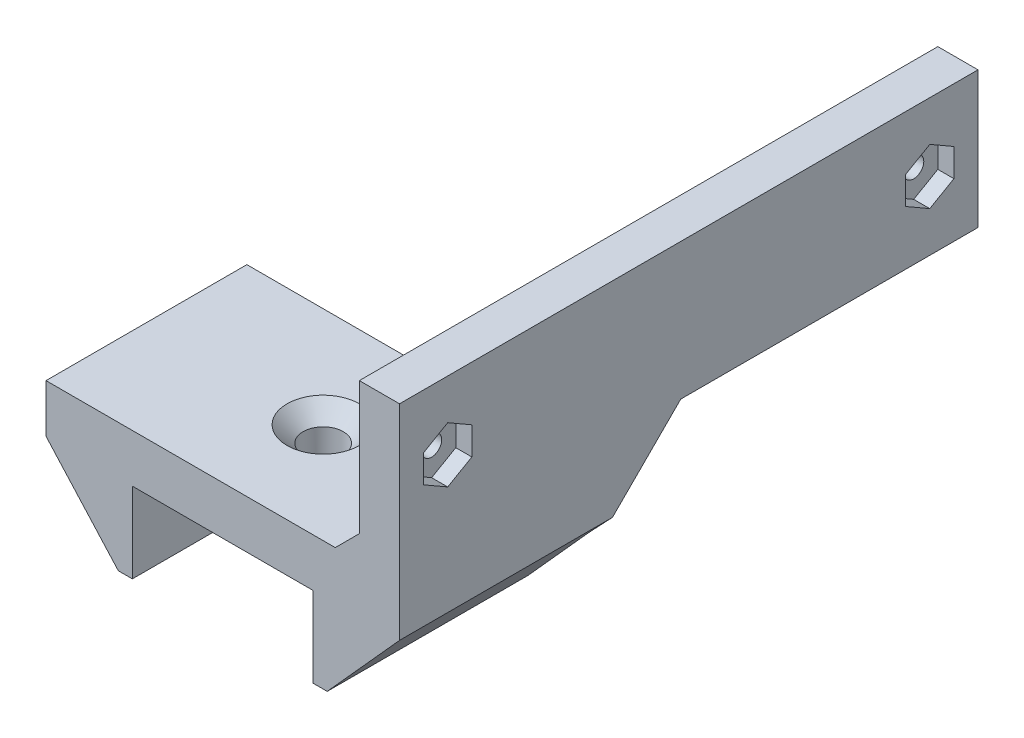
ISO-10303-21;
HEADER;
FILE_DESCRIPTION(('STEP AP214'),'2;1');
FILE_NAME('part.step','',(''),(''),'','','');
FILE_SCHEMA(('AUTOMOTIVE_DESIGN { 1 0 10303 214 1 1 1 1 }'));
ENDSEC;
DATA;
#1=APPLICATION_CONTEXT('core data for automotive mechanical design processes');
#2=APPLICATION_PROTOCOL_DEFINITION('international standard','automotive_design',2000,#1);
#3=PRODUCT_CONTEXT('',#1,'mechanical');
#4=PRODUCT('Part','Part','',(#3));
#5=PRODUCT_RELATED_PRODUCT_CATEGORY('part','',(#4));
#6=PRODUCT_DEFINITION_FORMATION('','',#4);
#7=PRODUCT_DEFINITION_CONTEXT('part definition',#1,'design');
#8=PRODUCT_DEFINITION('design','',#6,#7);
#9=PRODUCT_DEFINITION_SHAPE('','',#8);
#10=(LENGTH_UNIT() NAMED_UNIT(*) SI_UNIT(.MILLI.,.METRE.));
#11=(NAMED_UNIT(*) PLANE_ANGLE_UNIT() SI_UNIT($,.RADIAN.));
#12=(NAMED_UNIT(*) SI_UNIT($,.STERADIAN.) SOLID_ANGLE_UNIT());
#13=UNCERTAINTY_MEASURE_WITH_UNIT(LENGTH_MEASURE(1.E-05),#10,'distance_accuracy_value','');
#14=(GEOMETRIC_REPRESENTATION_CONTEXT(3) GLOBAL_UNCERTAINTY_ASSIGNED_CONTEXT((#13)) GLOBAL_UNIT_ASSIGNED_CONTEXT((#10,
#11,#12)) REPRESENTATION_CONTEXT('',''));
#15=CARTESIAN_POINT('',(0.,0.,0.));
#16=DIRECTION('',(0.,0.,1.));
#17=DIRECTION('',(1.,0.,0.));
#18=AXIS2_PLACEMENT_3D('',#15,#16,#17);
#19=CARTESIAN_POINT('',(22.,0.,25.));
#20=DIRECTION('',(-1.,0.,0.));
#21=DIRECTION('',(0.,0.,1.));
#22=AXIS2_PLACEMENT_3D('',#19,#20,#21);
#23=PLANE('',#22);
#24=DIRECTION('',(0.,0.,-1.));
#25=VECTOR('',#24,1.);
#26=CARTESIAN_POINT('',(22.,0.,25.));
#27=LINE('',#26,#25);
#28=CARTESIAN_POINT('',(22.,0.,25.));
#29=VERTEX_POINT('',#28);
#30=CARTESIAN_POINT('',(22.,0.,-1.50000000000005));
#31=VERTEX_POINT('',#30);
#32=EDGE_CURVE('E58',#29,#31,#27,.T.);
#33=ORIENTED_EDGE('',*,*,#32,.T.);
#34=DIRECTION('',(0.,0.707106781186551,-0.707106781186544));
#35=VECTOR('',#34,1.);
#36=CARTESIAN_POINT('',(22.,-13.25,11.7499999999998));
#37=LINE('',#36,#35);
#38=CARTESIAN_POINT('',(22.,8.49999999999998,-9.99999999999995));
#39=VERTEX_POINT('',#38);
#40=EDGE_CURVE('E51',#31,#39,#37,.T.);
#41=ORIENTED_EDGE('',*,*,#40,.T.);
#42=DIRECTION('',(0.,0.,-1.));
#43=VECTOR('',#42,1.);
#44=CARTESIAN_POINT('',(22.,8.49999999999998,0.));
#45=LINE('',#44,#43);
#46=CARTESIAN_POINT('',(22.,8.49999999999999,-47.));
#47=VERTEX_POINT('',#46);
#48=EDGE_CURVE('E417',#39,#47,#45,.T.);
#49=ORIENTED_EDGE('',*,*,#48,.T.);
#50=DIRECTION('',(0.,1.,0.));
#51=VECTOR('',#50,1.);
#52=CARTESIAN_POINT('',(22.,25.5,-47.));
#53=LINE('',#52,#51);
#54=CARTESIAN_POINT('',(22.,25.5,-47.));
#55=VERTEX_POINT('',#54);
#56=EDGE_CURVE('E253',#47,#55,#53,.T.);
#57=ORIENTED_EDGE('',*,*,#56,.T.);
#58=DIRECTION('',(0.,0.,1.));
#59=VECTOR('',#58,1.);
#60=CARTESIAN_POINT('',(22.,25.5,25.));
#61=LINE('',#60,#59);
#62=CARTESIAN_POINT('',(22.,25.5,25.));
#63=VERTEX_POINT('',#62);
#64=EDGE_CURVE('E239',#55,#63,#61,.T.);
#65=ORIENTED_EDGE('',*,*,#64,.T.);
#66=DIRECTION('',(0.,1.,0.));
#67=VECTOR('',#66,1.);
#68=CARTESIAN_POINT('',(22.,0.,25.));
#69=LINE('',#68,#67);
#70=EDGE_CURVE('E277',#29,#63,#69,.T.);
#71=ORIENTED_EDGE('',*,*,#70,.F.);
#72=EDGE_LOOP('',(#33,#41,#49,#57,#65,#71));
#73=FACE_BOUND('',#72,.T.);
#74=DIRECTION('',(0.,-0.5,0.866025403784438));
#75=VECTOR('',#74,1.);
#76=CARTESIAN_POINT('',(22.,18.7320508075689,22.));
#77=LINE('',#76,#75);
#78=CARTESIAN_POINT('',(22.,20.4641016151377,19.));
#79=VERTEX_POINT('',#78);
#80=CARTESIAN_POINT('',(22.,18.7320508075689,22.));
#81=VERTEX_POINT('',#80);
#82=EDGE_CURVE('E465',#79,#81,#77,.T.);
#83=ORIENTED_EDGE('',*,*,#82,.F.);
#84=DIRECTION('',(0.,0.499999999999998,0.866025403784439));
#85=VECTOR('',#84,1.);
#86=CARTESIAN_POINT('',(22.,20.4641016151377,19.));
#87=LINE('',#86,#85);
#88=CARTESIAN_POINT('',(22.,18.7320508075689,16.));
#89=VERTEX_POINT('',#88);
#90=EDGE_CURVE('E383',#89,#79,#87,.T.);
#91=ORIENTED_EDGE('',*,*,#90,.F.);
#92=DIRECTION('',(0.,1.,0.));
#93=VECTOR('',#92,1.);
#94=CARTESIAN_POINT('',(22.,18.7320508075689,16.));
#95=LINE('',#94,#93);
#96=CARTESIAN_POINT('',(22.,15.2679491924311,16.));
#97=VERTEX_POINT('',#96);
#98=EDGE_CURVE('E448',#97,#89,#95,.T.);
#99=ORIENTED_EDGE('',*,*,#98,.F.);
#100=DIRECTION('',(0.,0.5,-0.866025403784439));
#101=VECTOR('',#100,1.);
#102=CARTESIAN_POINT('',(22.,15.2679491924311,16.));
#103=LINE('',#102,#101);
#104=CARTESIAN_POINT('',(22.,13.5358983848622,19.));
#105=VERTEX_POINT('',#104);
#106=EDGE_CURVE('E453',#105,#97,#103,.T.);
#107=ORIENTED_EDGE('',*,*,#106,.F.);
#108=DIRECTION('',(0.,-0.499999999999999,-0.866025403784439));
#109=VECTOR('',#108,1.);
#110=CARTESIAN_POINT('',(22.,13.5358983848622,19.));
#111=LINE('',#110,#109);
#112=CARTESIAN_POINT('',(22.,15.2679491924311,22.));
#113=VERTEX_POINT('',#112);
#114=EDGE_CURVE('E457',#113,#105,#111,.T.);
#115=ORIENTED_EDGE('',*,*,#114,.F.);
#116=DIRECTION('',(0.,-1.,0.));
#117=VECTOR('',#116,1.);
#118=CARTESIAN_POINT('',(22.,15.2679491924311,22.));
#119=LINE('',#118,#117);
#120=EDGE_CURVE('E461',#81,#113,#119,.T.);
#121=ORIENTED_EDGE('',*,*,#120,.F.);
#122=EDGE_LOOP('',(#83,#91,#99,#107,#115,#121));
#123=FACE_BOUND('',#122,.T.);
#124=DIRECTION('',(0.,0.499999999999998,-0.866025403784439));
#125=VECTOR('',#124,1.);
#126=CARTESIAN_POINT('',(22.,20.4641016151377,-41.));
#127=LINE('',#126,#125);
#128=CARTESIAN_POINT('',(22.,18.7320508075689,-38.));
#129=VERTEX_POINT('',#128);
#130=CARTESIAN_POINT('',(22.,20.4641016151377,-41.));
#131=VERTEX_POINT('',#130);
#132=EDGE_CURVE('E534',#129,#131,#127,.T.);
#133=ORIENTED_EDGE('',*,*,#132,.T.);
#134=DIRECTION('',(0.,-0.5,-0.866025403784438));
#135=VECTOR('',#134,1.);
#136=CARTESIAN_POINT('',(22.,18.7320508075689,-44.));
#137=LINE('',#136,#135);
#138=CARTESIAN_POINT('',(22.,18.7320508075689,-44.));
#139=VERTEX_POINT('',#138);
#140=EDGE_CURVE('E513',#131,#139,#137,.T.);
#141=ORIENTED_EDGE('',*,*,#140,.T.);
#142=DIRECTION('',(0.,-1.,0.));
#143=VECTOR('',#142,1.);
#144=CARTESIAN_POINT('',(22.,15.2679491924311,-44.));
#145=LINE('',#144,#143);
#146=CARTESIAN_POINT('',(22.,15.2679491924311,-44.));
#147=VERTEX_POINT('',#146);
#148=EDGE_CURVE('E518',#139,#147,#145,.T.);
#149=ORIENTED_EDGE('',*,*,#148,.T.);
#150=DIRECTION('',(0.,-0.499999999999999,0.866025403784439));
#151=VECTOR('',#150,1.);
#152=CARTESIAN_POINT('',(22.,13.5358983848622,-41.));
#153=LINE('',#152,#151);
#154=CARTESIAN_POINT('',(22.,13.5358983848622,-41.));
#155=VERTEX_POINT('',#154);
#156=EDGE_CURVE('E522',#147,#155,#153,.T.);
#157=ORIENTED_EDGE('',*,*,#156,.T.);
#158=DIRECTION('',(0.,0.5,0.866025403784439));
#159=VECTOR('',#158,1.);
#160=CARTESIAN_POINT('',(22.,15.2679491924311,-38.));
#161=LINE('',#160,#159);
#162=CARTESIAN_POINT('',(22.,15.2679491924311,-38.));
#163=VERTEX_POINT('',#162);
#164=EDGE_CURVE('E526',#155,#163,#161,.T.);
#165=ORIENTED_EDGE('',*,*,#164,.T.);
#166=DIRECTION('',(0.,1.,0.));
#167=VECTOR('',#166,1.);
#168=CARTESIAN_POINT('',(22.,18.7320508075689,-38.));
#169=LINE('',#168,#167);
#170=EDGE_CURVE('E530',#163,#129,#169,.T.);
#171=ORIENTED_EDGE('',*,*,#170,.T.);
#172=EDGE_LOOP('',(#133,#141,#149,#157,#165,#171));
#173=FACE_BOUND('',#172,.T.);
#174=ADVANCED_FACE('F41',(#73,#123,#173),#23,.F.);
#175=CARTESIAN_POINT('',(11.25,0.,25.));
#176=DIRECTION('',(1.,0.,0.));
#177=DIRECTION('',(0.,0.,-1.));
#178=AXIS2_PLACEMENT_3D('',#175,#176,#177);
#179=PLANE('',#178);
#180=DIRECTION('',(0.,-1.,0.));
#181=VECTOR('',#180,1.);
#182=CARTESIAN_POINT('',(11.25,0.,0.));
#183=LINE('',#182,#181);
#184=CARTESIAN_POINT('',(11.25,0.,0.));
#185=VERTEX_POINT('',#184);
#186=CARTESIAN_POINT('',(11.25,-10.,0.));
#187=VERTEX_POINT('',#186);
#188=EDGE_CURVE('E299',#185,#187,#183,.T.);
#189=ORIENTED_EDGE('',*,*,#188,.T.);
#190=DIRECTION('',(0.,0.,-1.));
#191=VECTOR('',#190,1.);
#192=CARTESIAN_POINT('',(11.25,-10.,25.));
#193=LINE('',#192,#191);
#194=CARTESIAN_POINT('',(11.25,-10.,25.));
#195=VERTEX_POINT('',#194);
#196=EDGE_CURVE('E356',#195,#187,#193,.T.);
#197=ORIENTED_EDGE('',*,*,#196,.F.);
#198=DIRECTION('',(0.,-1.,0.));
#199=VECTOR('',#198,1.);
#200=CARTESIAN_POINT('',(11.25,0.,25.));
#201=LINE('',#200,#199);
#202=CARTESIAN_POINT('',(11.25,0.,25.));
#203=VERTEX_POINT('',#202);
#204=EDGE_CURVE('E266',#203,#195,#201,.T.);
#205=ORIENTED_EDGE('',*,*,#204,.F.);
#206=DIRECTION('',(0.,0.,-1.));
#207=VECTOR('',#206,1.);
#208=CARTESIAN_POINT('',(11.25,0.,25.));
#209=LINE('',#208,#207);
#210=EDGE_CURVE('E298',#203,#185,#209,.T.);
#211=ORIENTED_EDGE('',*,*,#210,.T.);
#212=EDGE_LOOP('',(#189,#197,#205,#211));
#213=FACE_BOUND('',#212,.T.);
#214=ADVANCED_FACE('F575',(#213),#179,.F.);
#215=CARTESIAN_POINT('',(11.25,-10.,25.));
#216=DIRECTION('',(0.,1.,0.));
#217=DIRECTION('',(0.,0.,1.));
#218=AXIS2_PLACEMENT_3D('',#215,#216,#217);
#219=PLANE('',#218);
#220=DIRECTION('',(1.,0.,0.));
#221=VECTOR('',#220,1.);
#222=CARTESIAN_POINT('',(11.25,-10.,0.));
#223=LINE('',#222,#221);
#224=CARTESIAN_POINT('',(13.,-10.,0.));
#225=VERTEX_POINT('',#224);
#226=EDGE_CURVE('E303',#187,#225,#223,.T.);
#227=ORIENTED_EDGE('',*,*,#226,.T.);
#228=DIRECTION('',(0.,0.,-1.));
#229=VECTOR('',#228,1.);
#230=CARTESIAN_POINT('',(13.,-10.,25.));
#231=LINE('',#230,#229);
#232=CARTESIAN_POINT('',(13.,-10.,25.));
#233=VERTEX_POINT('',#232);
#234=EDGE_CURVE('E352',#233,#225,#231,.T.);
#235=ORIENTED_EDGE('',*,*,#234,.F.);
#236=DIRECTION('',(1.,0.,0.));
#237=VECTOR('',#236,1.);
#238=CARTESIAN_POINT('',(11.25,-10.,25.));
#239=LINE('',#238,#237);
#240=EDGE_CURVE('E270',#195,#233,#239,.T.);
#241=ORIENTED_EDGE('',*,*,#240,.F.);
#242=ORIENTED_EDGE('',*,*,#196,.T.);
#243=EDGE_LOOP('',(#227,#235,#241,#242));
#244=FACE_BOUND('',#243,.T.);
#245=ADVANCED_FACE('F572',(#244),#219,.F.);
#246=CARTESIAN_POINT('',(13.,-10.,25.));
#247=DIRECTION('',(-0.743294146247166,0.66896473162245,0.));
#248=DIRECTION('',(-0.66896473162245,-0.743294146247166,0.));
#249=AXIS2_PLACEMENT_3D('',#246,#247,#248);
#250=PLANE('',#249);
#251=DIRECTION('',(0.66896473162245,0.743294146247166,0.));
#252=VECTOR('',#251,1.);
#253=CARTESIAN_POINT('',(13.,-10.,0.));
#254=LINE('',#253,#252);
#255=CARTESIAN_POINT('',(20.6499999999999,-1.50000000000007,0.));
#256=VERTEX_POINT('',#255);
#257=EDGE_CURVE('E306',#225,#256,#254,.T.);
#258=ORIENTED_EDGE('',*,*,#257,.T.);
#259=DIRECTION('',(0.536894987644706,0.596549986271895,-0.59654998627189));
#260=VECTOR('',#259,1.);
#261=CARTESIAN_POINT('',(7.71530249110317,-15.8718861209965,14.3718861209963));
#262=LINE('',#261,#260);
#263=EDGE_CURVE('E403',#256,#31,#262,.T.);
#264=ORIENTED_EDGE('',*,*,#263,.T.);
#265=ORIENTED_EDGE('',*,*,#32,.F.);
#266=DIRECTION('',(0.66896473162245,0.743294146247166,0.));
#267=VECTOR('',#266,1.);
#268=CARTESIAN_POINT('',(13.,-10.,25.));
#269=LINE('',#268,#267);
#270=EDGE_CURVE('E274',#233,#29,#269,.T.);
#271=ORIENTED_EDGE('',*,*,#270,.F.);
#272=ORIENTED_EDGE('',*,*,#234,.T.);
#273=EDGE_LOOP('',(#258,#264,#265,#271,#272));
#274=FACE_BOUND('',#273,.T.);
#275=ADVANCED_FACE('F565',(#274),#250,.F.);
#276=CARTESIAN_POINT('',(22.,5.99999999999999,25.));
#277=DIRECTION('',(0.,-1.,0.));
#278=DIRECTION('',(0.,0.,-1.));
#279=AXIS2_PLACEMENT_3D('',#276,#277,#278);
#280=PLANE('',#279);
#281=CARTESIAN_POINT('',(0.,5.99999999999999,12.5));
#282=DIRECTION('',(0.,-1.,0.));
#283=DIRECTION('',(0.,0.,-1.));
#284=AXIS2_PLACEMENT_3D('',#281,#282,#283);
#285=CIRCLE('',#284,4.5);
#286=CARTESIAN_POINT('',(0.,5.99999999999999,8.));
#287=VERTEX_POINT('',#286);
#288=EDGE_CURVE('E370',#287,#287,#285,.T.);
#289=ORIENTED_EDGE('',*,*,#288,.T.);
#290=EDGE_LOOP('',(#289));
#291=FACE_BOUND('',#290,.T.);
#292=DIRECTION('',(-1.,0.,0.));
#293=VECTOR('',#292,1.);
#294=CARTESIAN_POINT('',(22.,5.99999999999999,25.));
#295=LINE('',#294,#293);
#296=CARTESIAN_POINT('',(14.,5.99999999999999,25.));
#297=VERTEX_POINT('',#296);
#298=CARTESIAN_POINT('',(-22.,5.99999999999999,25.));
#299=VERTEX_POINT('',#298);
#300=EDGE_CURVE('E280',#297,#299,#295,.T.);
#301=ORIENTED_EDGE('',*,*,#300,.F.);
#302=DIRECTION('',(0.,0.,-1.));
#303=VECTOR('',#302,1.);
#304=CARTESIAN_POINT('',(14.,5.99999999999999,0.));
#305=LINE('',#304,#303);
#306=CARTESIAN_POINT('',(14.,5.99999999999999,0.));
#307=VERTEX_POINT('',#306);
#308=EDGE_CURVE('E374',#297,#307,#305,.T.);
#309=ORIENTED_EDGE('',*,*,#308,.T.);
#310=DIRECTION('',(-1.,0.,0.));
#311=VECTOR('',#310,1.);
#312=CARTESIAN_POINT('',(22.,5.99999999999999,0.));
#313=LINE('',#312,#311);
#314=CARTESIAN_POINT('',(-22.,5.99999999999999,0.));
#315=VERTEX_POINT('',#314);
#316=EDGE_CURVE('E310',#307,#315,#313,.T.);
#317=ORIENTED_EDGE('',*,*,#316,.T.);
#318=DIRECTION('',(0.,0.,-1.));
#319=VECTOR('',#318,1.);
#320=CARTESIAN_POINT('',(-22.,5.99999999999999,25.));
#321=LINE('',#320,#319);
#322=EDGE_CURVE('E346',#299,#315,#321,.T.);
#323=ORIENTED_EDGE('',*,*,#322,.F.);
#324=EDGE_LOOP('',(#301,#309,#317,#323));
#325=FACE_BOUND('',#324,.T.);
#326=ADVANCED_FACE('F603',(#291,#325),#280,.F.);
#327=CARTESIAN_POINT('',(-22.,5.99999999999999,25.));
#328=DIRECTION('',(1.,0.,0.));
#329=DIRECTION('',(0.,0.,-1.));
#330=AXIS2_PLACEMENT_3D('',#327,#328,#329);
#331=PLANE('',#330);
#332=DIRECTION('',(0.,-1.,0.));
#333=VECTOR('',#332,1.);
#334=CARTESIAN_POINT('',(-22.,5.99999999999999,0.));
#335=LINE('',#334,#333);
#336=CARTESIAN_POINT('',(-22.,0.,0.));
#337=VERTEX_POINT('',#336);
#338=EDGE_CURVE('E313',#315,#337,#335,.T.);
#339=ORIENTED_EDGE('',*,*,#338,.T.);
#340=DIRECTION('',(0.,0.,-1.));
#341=VECTOR('',#340,1.);
#342=CARTESIAN_POINT('',(-22.,0.,25.));
#343=LINE('',#342,#341);
#344=CARTESIAN_POINT('',(-22.,0.,25.));
#345=VERTEX_POINT('',#344);
#346=EDGE_CURVE('E342',#345,#337,#343,.T.);
#347=ORIENTED_EDGE('',*,*,#346,.F.);
#348=DIRECTION('',(0.,-1.,0.));
#349=VECTOR('',#348,1.);
#350=CARTESIAN_POINT('',(-22.,5.99999999999999,25.));
#351=LINE('',#350,#349);
#352=EDGE_CURVE('E283',#299,#345,#351,.T.);
#353=ORIENTED_EDGE('',*,*,#352,.F.);
#354=ORIENTED_EDGE('',*,*,#322,.T.);
#355=EDGE_LOOP('',(#339,#347,#353,#354));
#356=FACE_BOUND('',#355,.T.);
#357=ADVANCED_FACE('F598',(#356),#331,.F.);
#358=CARTESIAN_POINT('',(-22.,0.,25.));
#359=DIRECTION('',(0.743294146247166,0.66896473162245,0.));
#360=DIRECTION('',(-0.66896473162245,0.743294146247166,0.));
#361=AXIS2_PLACEMENT_3D('',#358,#359,#360);
#362=PLANE('',#361);
#363=DIRECTION('',(0.66896473162245,-0.743294146247166,0.));
#364=VECTOR('',#363,1.);
#365=CARTESIAN_POINT('',(-22.,0.,0.));
#366=LINE('',#365,#364);
#367=CARTESIAN_POINT('',(-13.,-10.,0.));
#368=VERTEX_POINT('',#367);
#369=EDGE_CURVE('E316',#337,#368,#366,.T.);
#370=ORIENTED_EDGE('',*,*,#369,.T.);
#371=DIRECTION('',(0.,0.,-1.));
#372=VECTOR('',#371,1.);
#373=CARTESIAN_POINT('',(-13.,-10.,25.));
#374=LINE('',#373,#372);
#375=CARTESIAN_POINT('',(-13.,-10.,25.));
#376=VERTEX_POINT('',#375);
#377=EDGE_CURVE('E338',#376,#368,#374,.T.);
#378=ORIENTED_EDGE('',*,*,#377,.F.);
#379=DIRECTION('',(0.66896473162245,-0.743294146247166,0.));
#380=VECTOR('',#379,1.);
#381=CARTESIAN_POINT('',(-22.,0.,25.));
#382=LINE('',#381,#380);
#383=EDGE_CURVE('E286',#345,#376,#382,.T.);
#384=ORIENTED_EDGE('',*,*,#383,.F.);
#385=ORIENTED_EDGE('',*,*,#346,.T.);
#386=EDGE_LOOP('',(#370,#378,#384,#385));
#387=FACE_BOUND('',#386,.T.);
#388=ADVANCED_FACE('F594',(#387),#362,.F.);
#389=CARTESIAN_POINT('',(-13.,-10.,25.));
#390=DIRECTION('',(0.,1.,0.));
#391=DIRECTION('',(0.,0.,1.));
#392=AXIS2_PLACEMENT_3D('',#389,#390,#391);
#393=PLANE('',#392);
#394=DIRECTION('',(1.,0.,0.));
#395=VECTOR('',#394,1.);
#396=CARTESIAN_POINT('',(-13.,-10.,0.));
#397=LINE('',#396,#395);
#398=CARTESIAN_POINT('',(-11.25,-10.,0.));
#399=VERTEX_POINT('',#398);
#400=EDGE_CURVE('E319',#368,#399,#397,.T.);
#401=ORIENTED_EDGE('',*,*,#400,.T.);
#402=DIRECTION('',(0.,0.,-1.));
#403=VECTOR('',#402,1.);
#404=CARTESIAN_POINT('',(-11.25,-10.,25.));
#405=LINE('',#404,#403);
#406=CARTESIAN_POINT('',(-11.25,-10.,25.));
#407=VERTEX_POINT('',#406);
#408=EDGE_CURVE('E334',#407,#399,#405,.T.);
#409=ORIENTED_EDGE('',*,*,#408,.F.);
#410=DIRECTION('',(1.,0.,0.));
#411=VECTOR('',#410,1.);
#412=CARTESIAN_POINT('',(-13.,-10.,25.));
#413=LINE('',#412,#411);
#414=EDGE_CURVE('E289',#376,#407,#413,.T.);
#415=ORIENTED_EDGE('',*,*,#414,.F.);
#416=ORIENTED_EDGE('',*,*,#377,.T.);
#417=EDGE_LOOP('',(#401,#409,#415,#416));
#418=FACE_BOUND('',#417,.T.);
#419=ADVANCED_FACE('F590',(#418),#393,.F.);
#420=CARTESIAN_POINT('',(-11.25,-10.,25.));
#421=DIRECTION('',(-1.,0.,0.));
#422=DIRECTION('',(0.,0.,1.));
#423=AXIS2_PLACEMENT_3D('',#420,#421,#422);
#424=PLANE('',#423);
#425=DIRECTION('',(0.,1.,0.));
#426=VECTOR('',#425,1.);
#427=CARTESIAN_POINT('',(-11.25,-10.,0.));
#428=LINE('',#427,#426);
#429=CARTESIAN_POINT('',(-11.25,0.,0.));
#430=VERTEX_POINT('',#429);
#431=EDGE_CURVE('E322',#399,#430,#428,.T.);
#432=ORIENTED_EDGE('',*,*,#431,.T.);
#433=DIRECTION('',(0.,0.,-1.));
#434=VECTOR('',#433,1.);
#435=CARTESIAN_POINT('',(-11.25,0.,25.));
#436=LINE('',#435,#434);
#437=CARTESIAN_POINT('',(-11.25,0.,25.));
#438=VERTEX_POINT('',#437);
#439=EDGE_CURVE('E330',#438,#430,#436,.T.);
#440=ORIENTED_EDGE('',*,*,#439,.F.);
#441=DIRECTION('',(0.,1.,0.));
#442=VECTOR('',#441,1.);
#443=CARTESIAN_POINT('',(-11.25,-10.,25.));
#444=LINE('',#443,#442);
#445=EDGE_CURVE('E292',#407,#438,#444,.T.);
#446=ORIENTED_EDGE('',*,*,#445,.F.);
#447=ORIENTED_EDGE('',*,*,#408,.T.);
#448=EDGE_LOOP('',(#432,#440,#446,#447));
#449=FACE_BOUND('',#448,.T.);
#450=ADVANCED_FACE('F585',(#449),#424,.F.);
#451=CARTESIAN_POINT('',(-11.25,0.,25.));
#452=DIRECTION('',(0.,1.,0.));
#453=DIRECTION('',(0.,0.,1.));
#454=AXIS2_PLACEMENT_3D('',#451,#452,#453);
#455=PLANE('',#454);
#456=CARTESIAN_POINT('',(0.,0.,12.5));
#457=DIRECTION('',(0.,1.,0.));
#458=DIRECTION('',(0.,0.,1.));
#459=AXIS2_PLACEMENT_3D('',#456,#457,#458);
#460=CIRCLE('',#459,2.5);
#461=CARTESIAN_POINT('',(0.,0.,15.));
#462=VERTEX_POINT('',#461);
#463=EDGE_CURVE('E361',#462,#462,#460,.T.);
#464=ORIENTED_EDGE('',*,*,#463,.T.);
#465=EDGE_LOOP('',(#464));
#466=FACE_BOUND('',#465,.T.);
#467=DIRECTION('',(1.,0.,0.));
#468=VECTOR('',#467,1.);
#469=CARTESIAN_POINT('',(-11.25,0.,0.));
#470=LINE('',#469,#468);
#471=EDGE_CURVE('E271',#430,#185,#470,.T.);
#472=ORIENTED_EDGE('',*,*,#471,.T.);
#473=ORIENTED_EDGE('',*,*,#210,.F.);
#474=DIRECTION('',(1.,0.,0.));
#475=VECTOR('',#474,1.);
#476=CARTESIAN_POINT('',(-11.25,0.,25.));
#477=LINE('',#476,#475);
#478=EDGE_CURVE('E295',#438,#203,#477,.T.);
#479=ORIENTED_EDGE('',*,*,#478,.F.);
#480=ORIENTED_EDGE('',*,*,#439,.T.);
#481=EDGE_LOOP('',(#472,#473,#479,#480));
#482=FACE_BOUND('',#481,.T.);
#483=ADVANCED_FACE('F579',(#466,#482),#455,.F.);
#484=CARTESIAN_POINT('',(0.,0.,25.));
#485=DIRECTION('',(0.,0.,1.));
#486=DIRECTION('',(1.,0.,0.));
#487=AXIS2_PLACEMENT_3D('',#484,#485,#486);
#488=PLANE('',#487);
#489=ORIENTED_EDGE('',*,*,#204,.T.);
#490=ORIENTED_EDGE('',*,*,#240,.T.);
#491=ORIENTED_EDGE('',*,*,#270,.T.);
#492=ORIENTED_EDGE('',*,*,#70,.T.);
#493=DIRECTION('',(1.,0.,0.));
#494=VECTOR('',#493,1.);
#495=CARTESIAN_POINT('',(17.,25.5,25.));
#496=LINE('',#495,#494);
#497=CARTESIAN_POINT('',(17.,25.5,25.));
#498=VERTEX_POINT('',#497);
#499=EDGE_CURVE('E260',#498,#63,#496,.T.);
#500=ORIENTED_EDGE('',*,*,#499,.F.);
#501=DIRECTION('',(0.,-1.,0.));
#502=VECTOR('',#501,1.);
#503=CARTESIAN_POINT('',(17.,25.5,25.));
#504=LINE('',#503,#502);
#505=CARTESIAN_POINT('',(17.,8.99999999999998,25.));
#506=VERTEX_POINT('',#505);
#507=EDGE_CURVE('E256',#498,#506,#504,.T.);
#508=ORIENTED_EDGE('',*,*,#507,.T.);
#509=DIRECTION('',(0.707106781186552,0.707106781186543,0.));
#510=VECTOR('',#509,1.);
#511=CARTESIAN_POINT('',(14.,5.99999999999999,25.));
#512=LINE('',#511,#510);
#513=EDGE_CURVE('E394',#506,#297,#512,.F.);
#514=ORIENTED_EDGE('',*,*,#513,.T.);
#515=ORIENTED_EDGE('',*,*,#300,.T.);
#516=ORIENTED_EDGE('',*,*,#352,.T.);
#517=ORIENTED_EDGE('',*,*,#383,.T.);
#518=ORIENTED_EDGE('',*,*,#414,.T.);
#519=ORIENTED_EDGE('',*,*,#445,.T.);
#520=ORIENTED_EDGE('',*,*,#478,.T.);
#521=EDGE_LOOP('',(#489,#490,#491,#492,#500,#508,#514,#515,#516,#517,#518,#519,#520));
#522=FACE_BOUND('',#521,.T.);
#523=ADVANCED_FACE('F609',(#522),#488,.T.);
#524=CARTESIAN_POINT('',(0.,0.,0.));
#525=DIRECTION('',(0.,0.,1.));
#526=DIRECTION('',(1.,0.,0.));
#527=AXIS2_PLACEMENT_3D('',#524,#525,#526);
#528=PLANE('',#527);
#529=DIRECTION('',(0.,-1.,0.));
#530=VECTOR('',#529,1.);
#531=CARTESIAN_POINT('',(17.,25.5,0.));
#532=LINE('',#531,#530);
#533=CARTESIAN_POINT('',(17.,8.99999999999998,0.));
#534=VERTEX_POINT('',#533);
#535=CARTESIAN_POINT('',(17.,-1.50000000000007,0.));
#536=VERTEX_POINT('',#535);
#537=EDGE_CURVE('E249',#534,#536,#532,.T.);
#538=ORIENTED_EDGE('',*,*,#537,.T.);
#539=DIRECTION('',(1.,0.,0.));
#540=VECTOR('',#539,1.);
#541=CARTESIAN_POINT('',(0.,-1.50000000000007,0.));
#542=LINE('',#541,#540);
#543=EDGE_CURVE('E397',#536,#256,#542,.T.);
#544=ORIENTED_EDGE('',*,*,#543,.T.);
#545=ORIENTED_EDGE('',*,*,#257,.F.);
#546=ORIENTED_EDGE('',*,*,#226,.F.);
#547=ORIENTED_EDGE('',*,*,#188,.F.);
#548=ORIENTED_EDGE('',*,*,#471,.F.);
#549=ORIENTED_EDGE('',*,*,#431,.F.);
#550=ORIENTED_EDGE('',*,*,#400,.F.);
#551=ORIENTED_EDGE('',*,*,#369,.F.);
#552=ORIENTED_EDGE('',*,*,#338,.F.);
#553=ORIENTED_EDGE('',*,*,#316,.F.);
#554=DIRECTION('',(-0.707106781186552,-0.707106781186543,0.));
#555=VECTOR('',#554,1.);
#556=CARTESIAN_POINT('',(3.99999999999989,-3.99999999999994,0.));
#557=LINE('',#556,#555);
#558=EDGE_CURVE('E391',#307,#534,#557,.F.);
#559=ORIENTED_EDGE('',*,*,#558,.T.);
#560=EDGE_LOOP('',(#538,#544,#545,#546,#547,#548,#549,#550,#551,#552,#553,#559));
#561=FACE_BOUND('',#560,.T.);
#562=ADVANCED_FACE('F558',(#561),#528,.F.);
#563=CARTESIAN_POINT('',(17.,25.5,25.));
#564=DIRECTION('',(0.,1.,0.));
#565=DIRECTION('',(0.,0.,1.));
#566=AXIS2_PLACEMENT_3D('',#563,#564,#565);
#567=PLANE('',#566);
#568=ORIENTED_EDGE('',*,*,#64,.F.);
#569=DIRECTION('',(1.,0.,0.));
#570=VECTOR('',#569,1.);
#571=CARTESIAN_POINT('',(17.,25.5,-47.));
#572=LINE('',#571,#570);
#573=CARTESIAN_POINT('',(17.,25.5,-47.));
#574=VERTEX_POINT('',#573);
#575=EDGE_CURVE('E255',#574,#55,#572,.T.);
#576=ORIENTED_EDGE('',*,*,#575,.F.);
#577=DIRECTION('',(0.,0.,1.));
#578=VECTOR('',#577,1.);
#579=CARTESIAN_POINT('',(17.,25.5,25.));
#580=LINE('',#579,#578);
#581=EDGE_CURVE('E234',#574,#498,#580,.T.);
#582=ORIENTED_EDGE('',*,*,#581,.T.);
#583=ORIENTED_EDGE('',*,*,#499,.T.);
#584=EDGE_LOOP('',(#568,#576,#582,#583));
#585=FACE_BOUND('',#584,.T.);
#586=ADVANCED_FACE('F611',(#585),#567,.T.);
#587=CARTESIAN_POINT('',(17.,25.5,-47.));
#588=DIRECTION('',(0.,0.,-1.));
#589=DIRECTION('',(-1.,0.,0.));
#590=AXIS2_PLACEMENT_3D('',#587,#588,#589);
#591=PLANE('',#590);
#592=DIRECTION('',(1.,0.,0.));
#593=VECTOR('',#592,1.);
#594=CARTESIAN_POINT('',(17.,8.49999999999999,-47.));
#595=LINE('',#594,#593);
#596=CARTESIAN_POINT('',(17.,8.49999999999999,-47.));
#597=VERTEX_POINT('',#596);
#598=EDGE_CURVE('E244',#597,#47,#595,.T.);
#599=ORIENTED_EDGE('',*,*,#598,.F.);
#600=DIRECTION('',(0.,1.,0.));
#601=VECTOR('',#600,1.);
#602=CARTESIAN_POINT('',(17.,25.5,-47.));
#603=LINE('',#602,#601);
#604=EDGE_CURVE('E227',#597,#574,#603,.T.);
#605=ORIENTED_EDGE('',*,*,#604,.T.);
#606=ORIENTED_EDGE('',*,*,#575,.T.);
#607=ORIENTED_EDGE('',*,*,#56,.F.);
#608=EDGE_LOOP('',(#599,#605,#606,#607));
#609=FACE_BOUND('',#608,.T.);
#610=ADVANCED_FACE('F251',(#609),#591,.T.);
#611=CARTESIAN_POINT('',(17.,8.49999999999998,0.));
#612=DIRECTION('',(0.,-1.,0.));
#613=DIRECTION('',(0.,0.,-1.));
#614=AXIS2_PLACEMENT_3D('',#611,#612,#613);
#615=PLANE('',#614);
#616=ORIENTED_EDGE('',*,*,#48,.F.);
#617=DIRECTION('',(-1.,0.,0.));
#618=VECTOR('',#617,1.);
#619=CARTESIAN_POINT('',(17.,8.49999999999998,-9.99999999999995));
#620=LINE('',#619,#618);
#621=CARTESIAN_POINT('',(17.,8.49999999999998,-9.99999999999995));
#622=VERTEX_POINT('',#621);
#623=EDGE_CURVE('E247',#39,#622,#620,.T.);
#624=ORIENTED_EDGE('',*,*,#623,.T.);
#625=DIRECTION('',(0.,0.,1.));
#626=VECTOR('',#625,1.);
#627=CARTESIAN_POINT('',(17.,8.49999999999999,-47.));
#628=LINE('',#627,#626);
#629=EDGE_CURVE('E232',#597,#622,#628,.T.);
#630=ORIENTED_EDGE('',*,*,#629,.F.);
#631=ORIENTED_EDGE('',*,*,#598,.T.);
#632=EDGE_LOOP('',(#616,#624,#630,#631));
#633=FACE_BOUND('',#632,.T.);
#634=ADVANCED_FACE('F243',(#633),#615,.T.);
#635=CARTESIAN_POINT('',(17.,0.,0.));
#636=DIRECTION('',(1.,0.,0.));
#637=DIRECTION('',(0.,0.,-1.));
#638=AXIS2_PLACEMENT_3D('',#635,#636,#637);
#639=PLANE('',#638);
#640=CARTESIAN_POINT('',(17.,17.,19.));
#641=DIRECTION('',(1.,0.,0.));
#642=DIRECTION('',(0.,0.,-1.));
#643=AXIS2_PLACEMENT_3D('',#640,#641,#642);
#644=CIRCLE('',#643,1.25);
#645=CARTESIAN_POINT('',(17.,17.,17.75));
#646=VERTEX_POINT('',#645);
#647=EDGE_CURVE('E419',#646,#646,#644,.T.);
#648=ORIENTED_EDGE('',*,*,#647,.T.);
#649=EDGE_LOOP('',(#648));
#650=FACE_BOUND('',#649,.T.);
#651=ORIENTED_EDGE('',*,*,#507,.F.);
#652=ORIENTED_EDGE('',*,*,#581,.F.);
#653=ORIENTED_EDGE('',*,*,#604,.F.);
#654=ORIENTED_EDGE('',*,*,#629,.T.);
#655=DIRECTION('',(0.,-0.707106781186551,0.707106781186544));
#656=VECTOR('',#655,1.);
#657=CARTESIAN_POINT('',(17.,-0.750000000000026,-0.750000000000034));
#658=LINE('',#657,#656);
#659=EDGE_CURVE('E11',#622,#536,#658,.T.);
#660=ORIENTED_EDGE('',*,*,#659,.T.);
#661=ORIENTED_EDGE('',*,*,#537,.F.);
#662=DIRECTION('',(0.,0.,1.));
#663=VECTOR('',#662,1.);
#664=CARTESIAN_POINT('',(17.,8.99999999999998,25.));
#665=LINE('',#664,#663);
#666=EDGE_CURVE('E388',#534,#506,#665,.T.);
#667=ORIENTED_EDGE('',*,*,#666,.T.);
#668=EDGE_LOOP('',(#651,#652,#653,#654,#660,#661,#667));
#669=FACE_BOUND('',#668,.T.);
#670=CARTESIAN_POINT('',(17.,17.,-41.));
#671=DIRECTION('',(1.,0.,0.));
#672=DIRECTION('',(0.,0.,-1.));
#673=AXIS2_PLACEMENT_3D('',#670,#671,#672);
#674=CIRCLE('',#673,1.25);
#675=CARTESIAN_POINT('',(17.,17.,-42.25));
#676=VERTEX_POINT('',#675);
#677=EDGE_CURVE('E365',#676,#676,#674,.T.);
#678=ORIENTED_EDGE('',*,*,#677,.T.);
#679=EDGE_LOOP('',(#678));
#680=FACE_BOUND('',#679,.T.);
#681=ADVANCED_FACE('F230',(#650,#669,#680),#639,.F.);
#682=CARTESIAN_POINT('',(17.,17.,19.));
#683=DIRECTION('',(1.,0.,0.));
#684=DIRECTION('',(0.,0.,-1.));
#685=AXIS2_PLACEMENT_3D('',#682,#683,#684);
#686=CYLINDRICAL_SURFACE('',#685,1.25);
#687=CARTESIAN_POINT('',(20.,17.,19.));
#688=DIRECTION('',(-1.,0.,0.));
#689=DIRECTION('',(0.,0.,1.));
#690=AXIS2_PLACEMENT_3D('',#687,#688,#689);
#691=CIRCLE('',#690,1.25);
#692=CARTESIAN_POINT('',(20.,17.,20.25));
#693=VERTEX_POINT('',#692);
#694=EDGE_CURVE('E366',#693,#693,#691,.F.);
#695=ORIENTED_EDGE('',*,*,#694,.T.);
#696=EDGE_LOOP('',(#695));
#697=FACE_BOUND('',#696,.T.);
#698=ORIENTED_EDGE('',*,*,#647,.F.);
#699=EDGE_LOOP('',(#698));
#700=FACE_BOUND('',#699,.T.);
#701=ADVANCED_FACE('F702',(#697,#700),#686,.F.);
#702=CARTESIAN_POINT('',(17.,17.,-41.));
#703=DIRECTION('',(1.,0.,0.));
#704=DIRECTION('',(0.,0.,-1.));
#705=AXIS2_PLACEMENT_3D('',#702,#703,#704);
#706=CYLINDRICAL_SURFACE('',#705,1.25);
#707=CARTESIAN_POINT('',(20.,17.,-41.));
#708=DIRECTION('',(-1.,0.,0.));
#709=DIRECTION('',(0.,0.,1.));
#710=AXIS2_PLACEMENT_3D('',#707,#708,#709);
#711=CIRCLE('',#710,1.25);
#712=CARTESIAN_POINT('',(20.,17.,-39.75));
#713=VERTEX_POINT('',#712);
#714=EDGE_CURVE('E379',#713,#713,#711,.F.);
#715=ORIENTED_EDGE('',*,*,#714,.T.);
#716=EDGE_LOOP('',(#715));
#717=FACE_BOUND('',#716,.T.);
#718=ORIENTED_EDGE('',*,*,#677,.F.);
#719=EDGE_LOOP('',(#718));
#720=FACE_BOUND('',#719,.T.);
#721=ADVANCED_FACE('F698',(#717,#720),#706,.F.);
#722=CARTESIAN_POINT('',(0.,-10.,12.5));
#723=DIRECTION('',(0.,1.,0.));
#724=DIRECTION('',(0.,0.,1.));
#725=AXIS2_PLACEMENT_3D('',#722,#723,#724);
#726=CYLINDRICAL_SURFACE('',#725,2.5);
#727=CARTESIAN_POINT('',(0.,4.,12.5));
#728=DIRECTION('',(0.,-1.,0.));
#729=DIRECTION('',(0.,0.,-1.));
#730=AXIS2_PLACEMENT_3D('',#727,#728,#729);
#731=CIRCLE('',#730,2.5);
#732=CARTESIAN_POINT('',(0.,4.,10.));
#733=VERTEX_POINT('',#732);
#734=EDGE_CURVE('E360',#733,#733,#731,.F.);
#735=ORIENTED_EDGE('',*,*,#734,.T.);
#736=EDGE_LOOP('',(#735));
#737=FACE_BOUND('',#736,.T.);
#738=ORIENTED_EDGE('',*,*,#463,.F.);
#739=EDGE_LOOP('',(#738));
#740=FACE_BOUND('',#739,.T.);
#741=ADVANCED_FACE('F641',(#737,#740),#726,.F.);
#742=CARTESIAN_POINT('',(0.,4.,12.5));
#743=DIRECTION('',(0.,1.,0.));
#744=DIRECTION('',(0.,0.,1.));
#745=AXIS2_PLACEMENT_3D('',#742,#743,#744);
#746=CONICAL_SURFACE('',#745,2.5,0.78539816339745);
#747=ORIENTED_EDGE('',*,*,#288,.F.);
#748=EDGE_LOOP('',(#747));
#749=FACE_BOUND('',#748,.T.);
#750=ORIENTED_EDGE('',*,*,#734,.F.);
#751=EDGE_LOOP('',(#750));
#752=FACE_BOUND('',#751,.T.);
#753=ADVANCED_FACE('F635',(#749,#752),#746,.F.);
#754=CARTESIAN_POINT('',(20.,0.,0.));
#755=DIRECTION('',(-1.,0.,0.));
#756=DIRECTION('',(0.,0.,1.));
#757=AXIS2_PLACEMENT_3D('',#754,#755,#756);
#758=PLANE('',#757);
#759=DIRECTION('',(0.,0.499999999999998,0.866025403784439));
#760=VECTOR('',#759,1.);
#761=CARTESIAN_POINT('',(20.,20.4641016151377,19.));
#762=LINE('',#761,#760);
#763=CARTESIAN_POINT('',(20.,18.7320508075689,16.));
#764=VERTEX_POINT('',#763);
#765=CARTESIAN_POINT('',(20.,20.4641016151377,19.));
#766=VERTEX_POINT('',#765);
#767=EDGE_CURVE('E452',#764,#766,#762,.T.);
#768=ORIENTED_EDGE('',*,*,#767,.T.);
#769=DIRECTION('',(0.,-0.5,0.866025403784438));
#770=VECTOR('',#769,1.);
#771=CARTESIAN_POINT('',(20.,18.7320508075689,22.));
#772=LINE('',#771,#770);
#773=CARTESIAN_POINT('',(20.,18.7320508075689,22.));
#774=VERTEX_POINT('',#773);
#775=EDGE_CURVE('E486',#766,#774,#772,.T.);
#776=ORIENTED_EDGE('',*,*,#775,.T.);
#777=DIRECTION('',(0.,-1.,0.));
#778=VECTOR('',#777,1.);
#779=CARTESIAN_POINT('',(20.,15.2679491924311,22.));
#780=LINE('',#779,#778);
#781=CARTESIAN_POINT('',(20.,15.2679491924311,22.));
#782=VERTEX_POINT('',#781);
#783=EDGE_CURVE('E482',#774,#782,#780,.T.);
#784=ORIENTED_EDGE('',*,*,#783,.T.);
#785=DIRECTION('',(0.,-0.499999999999999,-0.866025403784439));
#786=VECTOR('',#785,1.);
#787=CARTESIAN_POINT('',(20.,13.5358983848622,19.));
#788=LINE('',#787,#786);
#789=CARTESIAN_POINT('',(20.,13.5358983848622,19.));
#790=VERTEX_POINT('',#789);
#791=EDGE_CURVE('E478',#782,#790,#788,.T.);
#792=ORIENTED_EDGE('',*,*,#791,.T.);
#793=DIRECTION('',(0.,0.5,-0.866025403784439));
#794=VECTOR('',#793,1.);
#795=CARTESIAN_POINT('',(20.,15.2679491924311,16.));
#796=LINE('',#795,#794);
#797=CARTESIAN_POINT('',(20.,15.2679491924311,16.));
#798=VERTEX_POINT('',#797);
#799=EDGE_CURVE('E474',#790,#798,#796,.T.);
#800=ORIENTED_EDGE('',*,*,#799,.T.);
#801=DIRECTION('',(0.,1.,0.));
#802=VECTOR('',#801,1.);
#803=CARTESIAN_POINT('',(20.,18.7320508075689,16.));
#804=LINE('',#803,#802);
#805=EDGE_CURVE('E434',#798,#764,#804,.T.);
#806=ORIENTED_EDGE('',*,*,#805,.T.);
#807=EDGE_LOOP('',(#768,#776,#784,#792,#800,#806));
#808=FACE_BOUND('',#807,.T.);
#809=ORIENTED_EDGE('',*,*,#694,.F.);
#810=EDGE_LOOP('',(#809));
#811=FACE_BOUND('',#810,.T.);
#812=ADVANCED_FACE('F640',(#808,#811),#758,.F.);
#813=CARTESIAN_POINT('',(20.,20.4641016151377,19.));
#814=DIRECTION('',(0.,0.866025403784439,-0.499999999999999));
#815=DIRECTION('',(0.,0.499999999999999,0.866025403784439));
#816=AXIS2_PLACEMENT_3D('',#813,#814,#815);
#817=PLANE('',#816);
#818=ORIENTED_EDGE('',*,*,#90,.T.);
#819=DIRECTION('',(1.,0.,0.));
#820=VECTOR('',#819,1.);
#821=CARTESIAN_POINT('',(20.,20.4641016151377,19.));
#822=LINE('',#821,#820);
#823=EDGE_CURVE('E429',#766,#79,#822,.T.);
#824=ORIENTED_EDGE('',*,*,#823,.F.);
#825=ORIENTED_EDGE('',*,*,#767,.F.);
#826=DIRECTION('',(1.,0.,0.));
#827=VECTOR('',#826,1.);
#828=CARTESIAN_POINT('',(20.,18.7320508075689,16.));
#829=LINE('',#828,#827);
#830=EDGE_CURVE('E378',#764,#89,#829,.T.);
#831=ORIENTED_EDGE('',*,*,#830,.T.);
#832=EDGE_LOOP('',(#818,#824,#825,#831));
#833=FACE_BOUND('',#832,.T.);
#834=ADVANCED_FACE('F671',(#833),#817,.F.);
#835=CARTESIAN_POINT('',(20.,18.7320508075689,16.));
#836=DIRECTION('',(0.,0.,-1.));
#837=DIRECTION('',(-1.,0.,0.));
#838=AXIS2_PLACEMENT_3D('',#835,#836,#837);
#839=PLANE('',#838);
#840=ORIENTED_EDGE('',*,*,#98,.T.);
#841=ORIENTED_EDGE('',*,*,#830,.F.);
#842=ORIENTED_EDGE('',*,*,#805,.F.);
#843=DIRECTION('',(1.,0.,0.));
#844=VECTOR('',#843,1.);
#845=CARTESIAN_POINT('',(20.,15.2679491924311,16.));
#846=LINE('',#845,#844);
#847=EDGE_CURVE('E443',#798,#97,#846,.T.);
#848=ORIENTED_EDGE('',*,*,#847,.T.);
#849=EDGE_LOOP('',(#840,#841,#842,#848));
#850=FACE_BOUND('',#849,.T.);
#851=ADVANCED_FACE('F673',(#850),#839,.F.);
#852=CARTESIAN_POINT('',(20.,15.2679491924311,16.));
#853=DIRECTION('',(0.,-0.866025403784439,-0.5));
#854=DIRECTION('',(0.,0.5,-0.866025403784439));
#855=AXIS2_PLACEMENT_3D('',#852,#853,#854);
#856=PLANE('',#855);
#857=ORIENTED_EDGE('',*,*,#106,.T.);
#858=ORIENTED_EDGE('',*,*,#847,.F.);
#859=ORIENTED_EDGE('',*,*,#799,.F.);
#860=DIRECTION('',(1.,0.,0.));
#861=VECTOR('',#860,1.);
#862=CARTESIAN_POINT('',(20.,13.5358983848622,19.));
#863=LINE('',#862,#861);
#864=EDGE_CURVE('E440',#790,#105,#863,.T.);
#865=ORIENTED_EDGE('',*,*,#864,.T.);
#866=EDGE_LOOP('',(#857,#858,#859,#865));
#867=FACE_BOUND('',#866,.T.);
#868=ADVANCED_FACE('F676',(#867),#856,.F.);
#869=CARTESIAN_POINT('',(20.,13.5358983848622,19.));
#870=DIRECTION('',(0.,-0.866025403784439,0.499999999999999));
#871=DIRECTION('',(0.,-0.499999999999999,-0.866025403784439));
#872=AXIS2_PLACEMENT_3D('',#869,#870,#871);
#873=PLANE('',#872);
#874=ORIENTED_EDGE('',*,*,#114,.T.);
#875=ORIENTED_EDGE('',*,*,#864,.F.);
#876=ORIENTED_EDGE('',*,*,#791,.F.);
#877=DIRECTION('',(1.,0.,0.));
#878=VECTOR('',#877,1.);
#879=CARTESIAN_POINT('',(20.,15.2679491924311,22.));
#880=LINE('',#879,#878);
#881=EDGE_CURVE('E437',#782,#113,#880,.T.);
#882=ORIENTED_EDGE('',*,*,#881,.T.);
#883=EDGE_LOOP('',(#874,#875,#876,#882));
#884=FACE_BOUND('',#883,.T.);
#885=ADVANCED_FACE('F680',(#884),#873,.F.);
#886=CARTESIAN_POINT('',(20.,15.2679491924311,22.));
#887=DIRECTION('',(0.,0.,1.));
#888=DIRECTION('',(0.,-1.,0.));
#889=AXIS2_PLACEMENT_3D('',#886,#887,#888);
#890=PLANE('',#889);
#891=ORIENTED_EDGE('',*,*,#120,.T.);
#892=ORIENTED_EDGE('',*,*,#881,.F.);
#893=ORIENTED_EDGE('',*,*,#783,.F.);
#894=DIRECTION('',(1.,0.,0.));
#895=VECTOR('',#894,1.);
#896=CARTESIAN_POINT('',(20.,18.7320508075689,22.));
#897=LINE('',#896,#895);
#898=EDGE_CURVE('E433',#774,#81,#897,.T.);
#899=ORIENTED_EDGE('',*,*,#898,.T.);
#900=EDGE_LOOP('',(#891,#892,#893,#899));
#901=FACE_BOUND('',#900,.T.);
#902=ADVANCED_FACE('F684',(#901),#890,.F.);
#903=CARTESIAN_POINT('',(20.,18.7320508075689,22.));
#904=DIRECTION('',(0.,0.866025403784438,0.5));
#905=DIRECTION('',(0.,-0.5,0.866025403784438));
#906=AXIS2_PLACEMENT_3D('',#903,#904,#905);
#907=PLANE('',#906);
#908=ORIENTED_EDGE('',*,*,#82,.T.);
#909=ORIENTED_EDGE('',*,*,#898,.F.);
#910=ORIENTED_EDGE('',*,*,#775,.F.);
#911=ORIENTED_EDGE('',*,*,#823,.T.);
#912=EDGE_LOOP('',(#908,#909,#910,#911));
#913=FACE_BOUND('',#912,.T.);
#914=ADVANCED_FACE('F688',(#913),#907,.F.);
#915=CARTESIAN_POINT('',(20.,0.,-22.));
#916=DIRECTION('',(-1.,0.,0.));
#917=DIRECTION('',(0.,0.,-1.));
#918=AXIS2_PLACEMENT_3D('',#915,#916,#917);
#919=PLANE('',#918);
#920=DIRECTION('',(0.,0.499999999999998,-0.866025403784439));
#921=VECTOR('',#920,1.);
#922=CARTESIAN_POINT('',(20.,20.4641016151377,-41.));
#923=LINE('',#922,#921);
#924=CARTESIAN_POINT('',(20.,18.7320508075689,-38.));
#925=VERTEX_POINT('',#924);
#926=CARTESIAN_POINT('',(20.,20.4641016151377,-41.));
#927=VERTEX_POINT('',#926);
#928=EDGE_CURVE('E517',#925,#927,#923,.T.);
#929=ORIENTED_EDGE('',*,*,#928,.F.);
#930=DIRECTION('',(0.,1.,0.));
#931=VECTOR('',#930,1.);
#932=CARTESIAN_POINT('',(20.,18.7320508075689,-38.));
#933=LINE('',#932,#931);
#934=CARTESIAN_POINT('',(20.,15.2679491924311,-38.));
#935=VERTEX_POINT('',#934);
#936=EDGE_CURVE('E549',#935,#925,#933,.T.);
#937=ORIENTED_EDGE('',*,*,#936,.F.);
#938=DIRECTION('',(0.,0.5,0.866025403784439));
#939=VECTOR('',#938,1.);
#940=CARTESIAN_POINT('',(20.,15.2679491924311,-38.));
#941=LINE('',#940,#939);
#942=CARTESIAN_POINT('',(20.,13.5358983848622,-41.));
#943=VERTEX_POINT('',#942);
#944=EDGE_CURVE('E546',#943,#935,#941,.T.);
#945=ORIENTED_EDGE('',*,*,#944,.F.);
#946=DIRECTION('',(0.,-0.499999999999999,0.866025403784439));
#947=VECTOR('',#946,1.);
#948=CARTESIAN_POINT('',(20.,13.5358983848622,-41.));
#949=LINE('',#948,#947);
#950=CARTESIAN_POINT('',(20.,15.2679491924311,-44.));
#951=VERTEX_POINT('',#950);
#952=EDGE_CURVE('E543',#951,#943,#949,.T.);
#953=ORIENTED_EDGE('',*,*,#952,.F.);
#954=DIRECTION('',(0.,-1.,0.));
#955=VECTOR('',#954,1.);
#956=CARTESIAN_POINT('',(20.,15.2679491924311,-44.));
#957=LINE('',#956,#955);
#958=CARTESIAN_POINT('',(20.,18.7320508075689,-44.));
#959=VERTEX_POINT('',#958);
#960=EDGE_CURVE('E540',#959,#951,#957,.T.);
#961=ORIENTED_EDGE('',*,*,#960,.F.);
#962=DIRECTION('',(0.,-0.5,-0.866025403784438));
#963=VECTOR('',#962,1.);
#964=CARTESIAN_POINT('',(20.,18.7320508075689,-44.));
#965=LINE('',#964,#963);
#966=EDGE_CURVE('E498',#927,#959,#965,.T.);
#967=ORIENTED_EDGE('',*,*,#966,.F.);
#968=EDGE_LOOP('',(#929,#937,#945,#953,#961,#967));
#969=FACE_BOUND('',#968,.T.);
#970=ORIENTED_EDGE('',*,*,#714,.F.);
#971=EDGE_LOOP('',(#970));
#972=FACE_BOUND('',#971,.T.);
#973=ADVANCED_FACE('F667',(#969,#972),#919,.F.);
#974=CARTESIAN_POINT('',(20.,20.4641016151377,-41.));
#975=DIRECTION('',(0.,-0.866025403784439,-0.499999999999999));
#976=DIRECTION('',(0.,0.499999999999999,-0.866025403784439));
#977=AXIS2_PLACEMENT_3D('',#974,#975,#976);
#978=PLANE('',#977);
#979=ORIENTED_EDGE('',*,*,#132,.F.);
#980=DIRECTION('',(1.,0.,0.));
#981=VECTOR('',#980,1.);
#982=CARTESIAN_POINT('',(20.,18.7320508075689,-38.));
#983=LINE('',#982,#981);
#984=EDGE_CURVE('E493',#925,#129,#983,.T.);
#985=ORIENTED_EDGE('',*,*,#984,.F.);
#986=ORIENTED_EDGE('',*,*,#928,.T.);
#987=DIRECTION('',(1.,0.,0.));
#988=VECTOR('',#987,1.);
#989=CARTESIAN_POINT('',(20.,20.4641016151377,-41.));
#990=LINE('',#989,#988);
#991=EDGE_CURVE('E384',#927,#131,#990,.T.);
#992=ORIENTED_EDGE('',*,*,#991,.T.);
#993=EDGE_LOOP('',(#979,#985,#986,#992));
#994=FACE_BOUND('',#993,.T.);
#995=ADVANCED_FACE('F663',(#994),#978,.T.);
#996=CARTESIAN_POINT('',(20.,18.7320508075689,-44.));
#997=DIRECTION('',(0.,-0.866025403784438,0.5));
#998=DIRECTION('',(0.,-0.5,-0.866025403784438));
#999=AXIS2_PLACEMENT_3D('',#996,#997,#998);
#1000=PLANE('',#999);
#1001=ORIENTED_EDGE('',*,*,#140,.F.);
#1002=ORIENTED_EDGE('',*,*,#991,.F.);
#1003=ORIENTED_EDGE('',*,*,#966,.T.);
#1004=DIRECTION('',(1.,0.,0.));
#1005=VECTOR('',#1004,1.);
#1006=CARTESIAN_POINT('',(20.,18.7320508075689,-44.));
#1007=LINE('',#1006,#1005);
#1008=EDGE_CURVE('E507',#959,#139,#1007,.T.);
#1009=ORIENTED_EDGE('',*,*,#1008,.T.);
#1010=EDGE_LOOP('',(#1001,#1002,#1003,#1009));
#1011=FACE_BOUND('',#1010,.T.);
#1012=ADVANCED_FACE('F666',(#1011),#1000,.T.);
#1013=CARTESIAN_POINT('',(20.,15.2679491924311,-44.));
#1014=DIRECTION('',(0.,0.,1.));
#1015=DIRECTION('',(0.,-1.,0.));
#1016=AXIS2_PLACEMENT_3D('',#1013,#1014,#1015);
#1017=PLANE('',#1016);
#1018=ORIENTED_EDGE('',*,*,#148,.F.);
#1019=ORIENTED_EDGE('',*,*,#1008,.F.);
#1020=ORIENTED_EDGE('',*,*,#960,.T.);
#1021=DIRECTION('',(1.,0.,0.));
#1022=VECTOR('',#1021,1.);
#1023=CARTESIAN_POINT('',(20.,15.2679491924311,-44.));
#1024=LINE('',#1023,#1022);
#1025=EDGE_CURVE('E504',#951,#147,#1024,.T.);
#1026=ORIENTED_EDGE('',*,*,#1025,.T.);
#1027=EDGE_LOOP('',(#1018,#1019,#1020,#1026));
#1028=FACE_BOUND('',#1027,.T.);
#1029=ADVANCED_FACE('F904',(#1028),#1017,.T.);
#1030=CARTESIAN_POINT('',(20.,13.5358983848622,-41.));
#1031=DIRECTION('',(0.,0.866025403784439,0.499999999999999));
#1032=DIRECTION('',(0.,-0.499999999999999,0.866025403784439));
#1033=AXIS2_PLACEMENT_3D('',#1030,#1031,#1032);
#1034=PLANE('',#1033);
#1035=ORIENTED_EDGE('',*,*,#156,.F.);
#1036=ORIENTED_EDGE('',*,*,#1025,.F.);
#1037=ORIENTED_EDGE('',*,*,#952,.T.);
#1038=DIRECTION('',(1.,0.,0.));
#1039=VECTOR('',#1038,1.);
#1040=CARTESIAN_POINT('',(20.,13.5358983848622,-41.));
#1041=LINE('',#1040,#1039);
#1042=EDGE_CURVE('E501',#943,#155,#1041,.T.);
#1043=ORIENTED_EDGE('',*,*,#1042,.T.);
#1044=EDGE_LOOP('',(#1035,#1036,#1037,#1043));
#1045=FACE_BOUND('',#1044,.T.);
#1046=ADVANCED_FACE('F657',(#1045),#1034,.T.);
#1047=CARTESIAN_POINT('',(20.,15.2679491924311,-38.));
#1048=DIRECTION('',(0.,0.866025403784439,-0.5));
#1049=DIRECTION('',(0.,0.5,0.866025403784439));
#1050=AXIS2_PLACEMENT_3D('',#1047,#1048,#1049);
#1051=PLANE('',#1050);
#1052=ORIENTED_EDGE('',*,*,#164,.F.);
#1053=ORIENTED_EDGE('',*,*,#1042,.F.);
#1054=ORIENTED_EDGE('',*,*,#944,.T.);
#1055=DIRECTION('',(1.,0.,0.));
#1056=VECTOR('',#1055,1.);
#1057=CARTESIAN_POINT('',(20.,15.2679491924311,-38.));
#1058=LINE('',#1057,#1056);
#1059=EDGE_CURVE('E497',#935,#163,#1058,.T.);
#1060=ORIENTED_EDGE('',*,*,#1059,.T.);
#1061=EDGE_LOOP('',(#1052,#1053,#1054,#1060));
#1062=FACE_BOUND('',#1061,.T.);
#1063=ADVANCED_FACE('F651',(#1062),#1051,.T.);
#1064=CARTESIAN_POINT('',(20.,18.7320508075689,-38.));
#1065=DIRECTION('',(0.,0.,-1.));
#1066=DIRECTION('',(-1.,0.,0.));
#1067=AXIS2_PLACEMENT_3D('',#1064,#1065,#1066);
#1068=PLANE('',#1067);
#1069=ORIENTED_EDGE('',*,*,#170,.F.);
#1070=ORIENTED_EDGE('',*,*,#1059,.F.);
#1071=ORIENTED_EDGE('',*,*,#936,.T.);
#1072=ORIENTED_EDGE('',*,*,#984,.T.);
#1073=EDGE_LOOP('',(#1069,#1070,#1071,#1072));
#1074=FACE_BOUND('',#1073,.T.);
#1075=ADVANCED_FACE('F646',(#1074),#1068,.T.);
#1076=CARTESIAN_POINT('',(14.,5.99999999999999,25.));
#1077=DIRECTION('',(-0.707106781186543,0.707106781186552,0.));
#1078=DIRECTION('',(0.,0.,1.));
#1079=AXIS2_PLACEMENT_3D('',#1076,#1077,#1078);
#1080=PLANE('',#1079);
#1081=ORIENTED_EDGE('',*,*,#666,.F.);
#1082=ORIENTED_EDGE('',*,*,#558,.F.);
#1083=ORIENTED_EDGE('',*,*,#308,.F.);
#1084=ORIENTED_EDGE('',*,*,#513,.F.);
#1085=EDGE_LOOP('',(#1081,#1082,#1083,#1084));
#1086=FACE_BOUND('',#1085,.T.);
#1087=ADVANCED_FACE('F607',(#1086),#1080,.T.);
#1088=CARTESIAN_POINT('',(0.,-1.50000000000007,0.));
#1089=DIRECTION('',(0.,0.707106781186544,0.707106781186551));
#1090=DIRECTION('',(1.,0.,0.));
#1091=AXIS2_PLACEMENT_3D('',#1088,#1089,#1090);
#1092=PLANE('',#1091);
#1093=ORIENTED_EDGE('',*,*,#659,.F.);
#1094=ORIENTED_EDGE('',*,*,#623,.F.);
#1095=ORIENTED_EDGE('',*,*,#40,.F.);
#1096=ORIENTED_EDGE('',*,*,#263,.F.);
#1097=ORIENTED_EDGE('',*,*,#543,.F.);
#1098=EDGE_LOOP('',(#1093,#1094,#1095,#1096,#1097));
#1099=FACE_BOUND('',#1098,.T.);
#1100=ADVANCED_FACE('F44',(#1099),#1092,.F.);
#1101=CLOSED_SHELL('',(#174,#214,#245,#275,#326,#357,#388,#419,#450,#483,#523,#562,#586,#610,
#634,#681,#701,#721,#741,#753,#812,#834,#851,#868,#885,#902,#914,#973,#995,#1012,#1029,#1046,
#1063,#1075,#1087,#1100));
#1102=MANIFOLD_SOLID_BREP('B2',#1101);
#1103=ADVANCED_BREP_SHAPE_REPRESENTATION('',(#18,#1102),#14);
#1104=SHAPE_DEFINITION_REPRESENTATION(#9,#1103);
ENDSEC;
END-ISO-10303-21;
